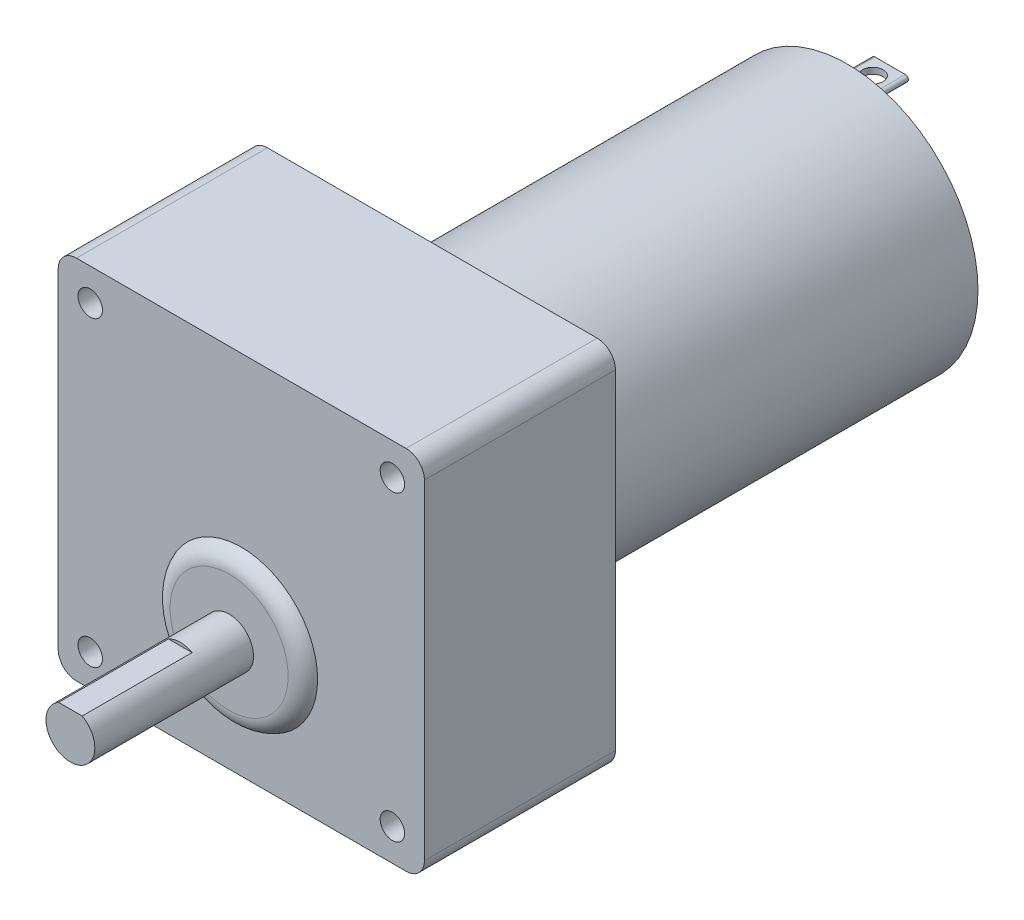
ISO-10303-21;
HEADER;
FILE_DESCRIPTION(('STEP AP214'),'2;1');
FILE_NAME('part.step','',(''),(''),'','','');
FILE_SCHEMA(('AUTOMOTIVE_DESIGN { 1 0 10303 214 1 1 1 1 }'));
ENDSEC;
DATA;
#1=APPLICATION_CONTEXT('core data for automotive mechanical design processes');
#2=APPLICATION_PROTOCOL_DEFINITION('international standard','automotive_design',2000,#1);
#3=PRODUCT_CONTEXT('',#1,'mechanical');
#4=PRODUCT('Part','Part','',(#3));
#5=PRODUCT_RELATED_PRODUCT_CATEGORY('part','',(#4));
#6=PRODUCT_DEFINITION_FORMATION('','',#4);
#7=PRODUCT_DEFINITION_CONTEXT('part definition',#1,'design');
#8=PRODUCT_DEFINITION('design','',#6,#7);
#9=PRODUCT_DEFINITION_SHAPE('','',#8);
#10=(LENGTH_UNIT() NAMED_UNIT(*) SI_UNIT(.MILLI.,.METRE.));
#11=(NAMED_UNIT(*) PLANE_ANGLE_UNIT() SI_UNIT($,.RADIAN.));
#12=(NAMED_UNIT(*) SI_UNIT($,.STERADIAN.) SOLID_ANGLE_UNIT());
#13=UNCERTAINTY_MEASURE_WITH_UNIT(LENGTH_MEASURE(1.E-05),#10,'distance_accuracy_value','');
#14=(GEOMETRIC_REPRESENTATION_CONTEXT(3) GLOBAL_UNCERTAINTY_ASSIGNED_CONTEXT((#13)) GLOBAL_UNIT_ASSIGNED_CONTEXT((#10,
#11,#12)) REPRESENTATION_CONTEXT('',''));
#15=CARTESIAN_POINT('',(0.,0.,0.));
#16=DIRECTION('',(0.,0.,1.));
#17=DIRECTION('',(1.,0.,0.));
#18=AXIS2_PLACEMENT_3D('',#15,#16,#17);
#19=CARTESIAN_POINT('',(0.,0.,0.));
#20=DIRECTION('',(0.,0.,1.));
#21=DIRECTION('',(1.,0.,0.));
#22=AXIS2_PLACEMENT_3D('',#19,#20,#21);
#23=PLANE('',#22);
#24=CARTESIAN_POINT('',(2.5,17.15,0.));
#25=DIRECTION('',(0.,0.,-1.));
#26=DIRECTION('',(-1.,0.,0.));
#27=AXIS2_PLACEMENT_3D('',#24,#25,#26);
#28=CIRCLE('',#27,0.5);
#29=CARTESIAN_POINT('',(2.5,17.65,0.));
#30=VERTEX_POINT('',#29);
#31=CARTESIAN_POINT('',(2.5,16.65,0.));
#32=VERTEX_POINT('',#31);
#33=EDGE_CURVE('E166',#30,#32,#28,.T.);
#34=ORIENTED_EDGE('',*,*,#33,.F.);
#35=DIRECTION('',(1.,0.,0.));
#36=VECTOR('',#35,1.);
#37=CARTESIAN_POINT('',(2.5,17.65,0.));
#38=LINE('',#37,#36);
#39=CARTESIAN_POINT('',(-2.5,17.65,0.));
#40=VERTEX_POINT('',#39);
#41=EDGE_CURVE('E199',#40,#30,#38,.T.);
#42=ORIENTED_EDGE('',*,*,#41,.F.);
#43=CARTESIAN_POINT('',(-2.5,17.15,0.));
#44=DIRECTION('',(0.,0.,-1.));
#45=DIRECTION('',(-1.,0.,0.));
#46=AXIS2_PLACEMENT_3D('',#43,#44,#45);
#47=CIRCLE('',#46,0.5);
#48=CARTESIAN_POINT('',(-2.5,16.65,0.));
#49=VERTEX_POINT('',#48);
#50=EDGE_CURVE('E211',#49,#40,#47,.T.);
#51=ORIENTED_EDGE('',*,*,#50,.F.);
#52=DIRECTION('',(-1.,0.,0.));
#53=VECTOR('',#52,1.);
#54=CARTESIAN_POINT('',(2.5,16.65,0.));
#55=LINE('',#54,#53);
#56=EDGE_CURVE('E208',#32,#49,#55,.T.);
#57=ORIENTED_EDGE('',*,*,#56,.F.);
#58=EDGE_LOOP('',(#34,#42,#51,#57));
#59=FACE_BOUND('',#58,.T.);
#60=CARTESIAN_POINT('',(0.,0.,0.));
#61=DIRECTION('',(0.,0.,1.));
#62=DIRECTION('',(1.,0.,0.));
#63=AXIS2_PLACEMENT_3D('',#60,#61,#62);
#64=CIRCLE('',#63,21.4);
#65=CARTESIAN_POINT('',(21.4,0.,0.));
#66=VERTEX_POINT('',#65);
#67=EDGE_CURVE('E286',#66,#66,#64,.T.);
#68=ORIENTED_EDGE('',*,*,#67,.F.);
#69=EDGE_LOOP('',(#68));
#70=FACE_BOUND('',#69,.T.);
#71=CARTESIAN_POINT('',(2.5,-17.15,0.));
#72=DIRECTION('',(0.,0.,-1.));
#73=DIRECTION('',(1.,0.,0.));
#74=AXIS2_PLACEMENT_3D('',#71,#72,#73);
#75=CIRCLE('',#74,0.5);
#76=CARTESIAN_POINT('',(2.5,-16.65,0.));
#77=VERTEX_POINT('',#76);
#78=CARTESIAN_POINT('',(2.5,-17.65,0.));
#79=VERTEX_POINT('',#78);
#80=EDGE_CURVE('E160',#77,#79,#75,.T.);
#81=ORIENTED_EDGE('',*,*,#80,.F.);
#82=DIRECTION('',(1.,0.,0.));
#83=VECTOR('',#82,1.);
#84=CARTESIAN_POINT('',(2.5,-16.65,0.));
#85=LINE('',#84,#83);
#86=CARTESIAN_POINT('',(-2.5,-16.65,0.));
#87=VERTEX_POINT('',#86);
#88=EDGE_CURVE('E162',#87,#77,#85,.T.);
#89=ORIENTED_EDGE('',*,*,#88,.F.);
#90=CARTESIAN_POINT('',(-2.5,-17.15,0.));
#91=DIRECTION('',(0.,0.,-1.));
#92=DIRECTION('',(1.,0.,0.));
#93=AXIS2_PLACEMENT_3D('',#90,#91,#92);
#94=CIRCLE('',#93,0.5);
#95=CARTESIAN_POINT('',(-2.5,-17.65,0.));
#96=VERTEX_POINT('',#95);
#97=EDGE_CURVE('E59',#96,#87,#94,.T.);
#98=ORIENTED_EDGE('',*,*,#97,.F.);
#99=DIRECTION('',(-1.,0.,0.));
#100=VECTOR('',#99,1.);
#101=CARTESIAN_POINT('',(2.5,-17.65,0.));
#102=LINE('',#101,#100);
#103=EDGE_CURVE('E54',#79,#96,#102,.T.);
#104=ORIENTED_EDGE('',*,*,#103,.F.);
#105=EDGE_LOOP('',(#81,#89,#98,#104));
#106=FACE_BOUND('',#105,.T.);
#107=ADVANCED_FACE('F38',(#59,#70,#106),#23,.F.);
#108=CARTESIAN_POINT('',(0.,-10.,109.3));
#109=DIRECTION('',(0.,0.,1.));
#110=DIRECTION('',(1.,0.,0.));
#111=AXIS2_PLACEMENT_3D('',#108,#109,#110);
#112=PLANE('',#111);
#113=CARTESIAN_POINT('',(0.,-10.,109.3));
#114=DIRECTION('',(0.,0.,1.));
#115=DIRECTION('',(1.,0.,0.));
#116=AXIS2_PLACEMENT_3D('',#113,#114,#115);
#117=CIRCLE('',#116,4.);
#118=CARTESIAN_POINT('',(1.93649167310371,-6.5,109.3));
#119=VERTEX_POINT('',#118);
#120=CARTESIAN_POINT('',(-1.93649167310371,-6.5,109.3));
#121=VERTEX_POINT('',#120);
#122=EDGE_CURVE('E240',#119,#121,#117,.T.);
#123=ORIENTED_EDGE('',*,*,#122,.T.);
#124=DIRECTION('',(1.,0.,0.));
#125=VECTOR('',#124,1.);
#126=CARTESIAN_POINT('',(0.,-6.5,109.3));
#127=LINE('',#126,#125);
#128=EDGE_CURVE('E227',#121,#119,#127,.T.);
#129=ORIENTED_EDGE('',*,*,#128,.T.);
#130=EDGE_LOOP('',(#123,#129));
#131=FACE_BOUND('',#130,.T.);
#132=ADVANCED_FACE('F385',(#131),#112,.T.);
#133=CARTESIAN_POINT('',(0.,0.,68.));
#134=DIRECTION('',(0.,0.,-1.));
#135=DIRECTION('',(-1.,0.,0.));
#136=AXIS2_PLACEMENT_3D('',#133,#134,#135);
#137=CYLINDRICAL_SURFACE('',#136,21.4);
#138=CARTESIAN_POINT('',(0.,0.,68.));
#139=DIRECTION('',(0.,0.,1.));
#140=DIRECTION('',(1.,0.,0.));
#141=AXIS2_PLACEMENT_3D('',#138,#139,#140);
#142=CIRCLE('',#141,21.4);
#143=CARTESIAN_POINT('',(21.4,0.,68.));
#144=VERTEX_POINT('',#143);
#145=EDGE_CURVE('E297',#144,#144,#142,.T.);
#146=ORIENTED_EDGE('',*,*,#145,.F.);
#147=EDGE_LOOP('',(#146));
#148=FACE_BOUND('',#147,.T.);
#149=ORIENTED_EDGE('',*,*,#67,.T.);
#150=EDGE_LOOP('',(#149));
#151=FACE_BOUND('',#150,.T.);
#152=ADVANCED_FACE('F391',(#148,#151),#137,.T.);
#153=CARTESIAN_POINT('',(0.,0.,99.3));
#154=DIRECTION('',(0.,0.,1.));
#155=DIRECTION('',(1.,0.,0.));
#156=AXIS2_PLACEMENT_3D('',#153,#154,#155);
#157=PLANE('',#156);
#158=CARTESIAN_POINT('',(0.,-10.,99.3));
#159=DIRECTION('',(0.,0.,1.));
#160=DIRECTION('',(1.,0.,0.));
#161=AXIS2_PLACEMENT_3D('',#158,#159,#160);
#162=CIRCLE('',#161,12.5);
#163=CARTESIAN_POINT('',(12.5,-10.,99.3));
#164=VERTEX_POINT('',#163);
#165=EDGE_CURVE('E243',#164,#164,#162,.T.);
#166=ORIENTED_EDGE('',*,*,#165,.F.);
#167=EDGE_LOOP('',(#166));
#168=FACE_BOUND('',#167,.T.);
#169=CARTESIAN_POINT('',(24.75,-24.75,99.3));
#170=DIRECTION('',(0.,0.,1.));
#171=DIRECTION('',(-1.,0.,0.));
#172=AXIS2_PLACEMENT_3D('',#169,#170,#171);
#173=CIRCLE('',#172,2.);
#174=CARTESIAN_POINT('',(22.75,-24.75,99.3));
#175=VERTEX_POINT('',#174);
#176=EDGE_CURVE('E255',#175,#175,#173,.T.);
#177=ORIENTED_EDGE('',*,*,#176,.F.);
#178=EDGE_LOOP('',(#177));
#179=FACE_BOUND('',#178,.T.);
#180=CARTESIAN_POINT('',(-24.75,24.75,99.3));
#181=DIRECTION('',(0.,0.,1.));
#182=DIRECTION('',(1.,0.,0.));
#183=AXIS2_PLACEMENT_3D('',#180,#181,#182);
#184=CIRCLE('',#183,2.);
#185=CARTESIAN_POINT('',(-22.75,24.75,99.3));
#186=VERTEX_POINT('',#185);
#187=EDGE_CURVE('E267',#186,#186,#184,.T.);
#188=ORIENTED_EDGE('',*,*,#187,.F.);
#189=EDGE_LOOP('',(#188));
#190=FACE_BOUND('',#189,.T.);
#191=DIRECTION('',(-1.,0.,0.));
#192=VECTOR('',#191,1.);
#193=CARTESIAN_POINT('',(-30.,30.,99.3));
#194=LINE('',#193,#192);
#195=CARTESIAN_POINT('',(27.,30.,99.3));
#196=VERTEX_POINT('',#195);
#197=CARTESIAN_POINT('',(-27.,30.,99.3));
#198=VERTEX_POINT('',#197);
#199=EDGE_CURVE('E276',#196,#198,#194,.T.);
#200=ORIENTED_EDGE('',*,*,#199,.T.);
#201=CARTESIAN_POINT('',(-27.,27.,99.3));
#202=DIRECTION('',(0.,0.,1.));
#203=DIRECTION('',(1.,0.,0.));
#204=AXIS2_PLACEMENT_3D('',#201,#202,#203);
#205=CIRCLE('',#204,3.);
#206=CARTESIAN_POINT('',(-30.,27.,99.3));
#207=VERTEX_POINT('',#206);
#208=EDGE_CURVE('E329',#198,#207,#205,.T.);
#209=ORIENTED_EDGE('',*,*,#208,.T.);
#210=DIRECTION('',(0.,-1.,0.));
#211=VECTOR('',#210,1.);
#212=CARTESIAN_POINT('',(-30.,30.,99.3));
#213=LINE('',#212,#211);
#214=CARTESIAN_POINT('',(-30.,-27.,99.3));
#215=VERTEX_POINT('',#214);
#216=EDGE_CURVE('E280',#207,#215,#213,.T.);
#217=ORIENTED_EDGE('',*,*,#216,.T.);
#218=CARTESIAN_POINT('',(-27.,-27.,99.3));
#219=DIRECTION('',(0.,0.,1.));
#220=DIRECTION('',(1.,0.,0.));
#221=AXIS2_PLACEMENT_3D('',#218,#219,#220);
#222=CIRCLE('',#221,3.);
#223=CARTESIAN_POINT('',(-27.,-30.,99.3));
#224=VERTEX_POINT('',#223);
#225=EDGE_CURVE('E327',#215,#224,#222,.T.);
#226=ORIENTED_EDGE('',*,*,#225,.T.);
#227=DIRECTION('',(1.,0.,0.));
#228=VECTOR('',#227,1.);
#229=CARTESIAN_POINT('',(-30.,-30.,99.3));
#230=LINE('',#229,#228);
#231=CARTESIAN_POINT('',(27.,-30.,99.3));
#232=VERTEX_POINT('',#231);
#233=EDGE_CURVE('E283',#224,#232,#230,.T.);
#234=ORIENTED_EDGE('',*,*,#233,.T.);
#235=CARTESIAN_POINT('',(27.,-27.,99.3));
#236=DIRECTION('',(0.,0.,1.));
#237=DIRECTION('',(1.,0.,0.));
#238=AXIS2_PLACEMENT_3D('',#235,#236,#237);
#239=CIRCLE('',#238,3.);
#240=CARTESIAN_POINT('',(30.,-27.,99.3));
#241=VERTEX_POINT('',#240);
#242=EDGE_CURVE('E325',#232,#241,#239,.T.);
#243=ORIENTED_EDGE('',*,*,#242,.T.);
#244=DIRECTION('',(0.,1.,0.));
#245=VECTOR('',#244,1.);
#246=CARTESIAN_POINT('',(30.,30.,99.3));
#247=LINE('',#246,#245);
#248=CARTESIAN_POINT('',(30.,27.,99.3));
#249=VERTEX_POINT('',#248);
#250=EDGE_CURVE('E273',#241,#249,#247,.T.);
#251=ORIENTED_EDGE('',*,*,#250,.T.);
#252=CARTESIAN_POINT('',(27.,27.,99.3));
#253=DIRECTION('',(0.,0.,1.));
#254=DIRECTION('',(1.,0.,0.));
#255=AXIS2_PLACEMENT_3D('',#252,#253,#254);
#256=CIRCLE('',#255,3.);
#257=EDGE_CURVE('E323',#249,#196,#256,.T.);
#258=ORIENTED_EDGE('',*,*,#257,.T.);
#259=EDGE_LOOP('',(#200,#209,#217,#226,#234,#243,#251,#258));
#260=FACE_BOUND('',#259,.T.);
#261=CARTESIAN_POINT('',(24.75,24.75,99.3));
#262=DIRECTION('',(0.,0.,1.));
#263=DIRECTION('',(1.,0.,0.));
#264=AXIS2_PLACEMENT_3D('',#261,#262,#263);
#265=CIRCLE('',#264,2.);
#266=CARTESIAN_POINT('',(26.75,24.75,99.3));
#267=VERTEX_POINT('',#266);
#268=EDGE_CURVE('E261',#267,#267,#265,.T.);
#269=ORIENTED_EDGE('',*,*,#268,.F.);
#270=EDGE_LOOP('',(#269));
#271=FACE_BOUND('',#270,.T.);
#272=CARTESIAN_POINT('',(-24.75,-24.75,99.3));
#273=DIRECTION('',(0.,0.,1.));
#274=DIRECTION('',(-1.,0.,0.));
#275=AXIS2_PLACEMENT_3D('',#272,#273,#274);
#276=CIRCLE('',#275,2.);
#277=CARTESIAN_POINT('',(-26.75,-24.75,99.3));
#278=VERTEX_POINT('',#277);
#279=EDGE_CURVE('E249',#278,#278,#276,.T.);
#280=ORIENTED_EDGE('',*,*,#279,.F.);
#281=EDGE_LOOP('',(#280));
#282=FACE_BOUND('',#281,.T.);
#283=ADVANCED_FACE('F345',(#168,#179,#190,#260,#271,#282),#157,.T.);
#284=CARTESIAN_POINT('',(0.,0.,68.));
#285=DIRECTION('',(0.,0.,1.));
#286=DIRECTION('',(1.,0.,0.));
#287=AXIS2_PLACEMENT_3D('',#284,#285,#286);
#288=PLANE('',#287);
#289=ORIENTED_EDGE('',*,*,#145,.T.);
#290=EDGE_LOOP('',(#289));
#291=FACE_BOUND('',#290,.T.);
#292=DIRECTION('',(0.,-1.,0.));
#293=VECTOR('',#292,1.);
#294=CARTESIAN_POINT('',(-30.,30.,68.));
#295=LINE('',#294,#293);
#296=CARTESIAN_POINT('',(-30.,27.,68.));
#297=VERTEX_POINT('',#296);
#298=CARTESIAN_POINT('',(-30.,-27.,68.));
#299=VERTEX_POINT('',#298);
#300=EDGE_CURVE('E292',#297,#299,#295,.T.);
#301=ORIENTED_EDGE('',*,*,#300,.F.);
#302=CARTESIAN_POINT('',(-27.,27.,68.));
#303=DIRECTION('',(0.,0.,1.));
#304=DIRECTION('',(1.,0.,0.));
#305=AXIS2_PLACEMENT_3D('',#302,#303,#304);
#306=CIRCLE('',#305,3.);
#307=CARTESIAN_POINT('',(-27.,30.,68.));
#308=VERTEX_POINT('',#307);
#309=EDGE_CURVE('E316',#297,#308,#306,.F.);
#310=ORIENTED_EDGE('',*,*,#309,.T.);
#311=DIRECTION('',(-1.,0.,0.));
#312=VECTOR('',#311,1.);
#313=CARTESIAN_POINT('',(-30.,30.,68.));
#314=LINE('',#313,#312);
#315=CARTESIAN_POINT('',(27.,30.,68.));
#316=VERTEX_POINT('',#315);
#317=EDGE_CURVE('E289',#316,#308,#314,.T.);
#318=ORIENTED_EDGE('',*,*,#317,.F.);
#319=CARTESIAN_POINT('',(27.,27.,68.));
#320=DIRECTION('',(0.,0.,1.));
#321=DIRECTION('',(1.,0.,0.));
#322=AXIS2_PLACEMENT_3D('',#319,#320,#321);
#323=CIRCLE('',#322,3.);
#324=CARTESIAN_POINT('',(30.,27.,68.));
#325=VERTEX_POINT('',#324);
#326=EDGE_CURVE('E310',#316,#325,#323,.F.);
#327=ORIENTED_EDGE('',*,*,#326,.T.);
#328=DIRECTION('',(0.,1.,0.));
#329=VECTOR('',#328,1.);
#330=CARTESIAN_POINT('',(30.,30.,68.));
#331=LINE('',#330,#329);
#332=CARTESIAN_POINT('',(30.,-27.,68.));
#333=VERTEX_POINT('',#332);
#334=EDGE_CURVE('E270',#333,#325,#331,.T.);
#335=ORIENTED_EDGE('',*,*,#334,.F.);
#336=CARTESIAN_POINT('',(27.,-27.,68.));
#337=DIRECTION('',(0.,0.,1.));
#338=DIRECTION('',(1.,0.,0.));
#339=AXIS2_PLACEMENT_3D('',#336,#337,#338);
#340=CIRCLE('',#339,3.);
#341=CARTESIAN_POINT('',(27.,-30.,68.));
#342=VERTEX_POINT('',#341);
#343=EDGE_CURVE('E312',#333,#342,#340,.F.);
#344=ORIENTED_EDGE('',*,*,#343,.T.);
#345=DIRECTION('',(1.,0.,0.));
#346=VECTOR('',#345,1.);
#347=CARTESIAN_POINT('',(-30.,-30.,68.));
#348=LINE('',#347,#346);
#349=CARTESIAN_POINT('',(-27.,-30.,68.));
#350=VERTEX_POINT('',#349);
#351=EDGE_CURVE('E277',#350,#342,#348,.T.);
#352=ORIENTED_EDGE('',*,*,#351,.F.);
#353=CARTESIAN_POINT('',(-27.,-27.,68.));
#354=DIRECTION('',(0.,0.,1.));
#355=DIRECTION('',(1.,0.,0.));
#356=AXIS2_PLACEMENT_3D('',#353,#354,#355);
#357=CIRCLE('',#356,3.);
#358=EDGE_CURVE('E314',#350,#299,#357,.F.);
#359=ORIENTED_EDGE('',*,*,#358,.T.);
#360=EDGE_LOOP('',(#301,#310,#318,#327,#335,#344,#352,#359));
#361=FACE_BOUND('',#360,.T.);
#362=CARTESIAN_POINT('',(-24.75,24.75,68.));
#363=DIRECTION('',(0.,0.,1.));
#364=DIRECTION('',(1.,0.,0.));
#365=AXIS2_PLACEMENT_3D('',#362,#363,#364);
#366=CIRCLE('',#365,2.);
#367=CARTESIAN_POINT('',(-22.75,24.75,68.));
#368=VERTEX_POINT('',#367);
#369=EDGE_CURVE('E264',#368,#368,#366,.T.);
#370=ORIENTED_EDGE('',*,*,#369,.T.);
#371=EDGE_LOOP('',(#370));
#372=FACE_BOUND('',#371,.T.);
#373=CARTESIAN_POINT('',(24.75,24.75,68.));
#374=DIRECTION('',(0.,0.,1.));
#375=DIRECTION('',(1.,0.,0.));
#376=AXIS2_PLACEMENT_3D('',#373,#374,#375);
#377=CIRCLE('',#376,2.);
#378=CARTESIAN_POINT('',(26.75,24.75,68.));
#379=VERTEX_POINT('',#378);
#380=EDGE_CURVE('E258',#379,#379,#377,.T.);
#381=ORIENTED_EDGE('',*,*,#380,.T.);
#382=EDGE_LOOP('',(#381));
#383=FACE_BOUND('',#382,.T.);
#384=CARTESIAN_POINT('',(24.75,-24.75,68.));
#385=DIRECTION('',(0.,0.,1.));
#386=DIRECTION('',(-1.,0.,0.));
#387=AXIS2_PLACEMENT_3D('',#384,#385,#386);
#388=CIRCLE('',#387,2.);
#389=CARTESIAN_POINT('',(22.75,-24.75,68.));
#390=VERTEX_POINT('',#389);
#391=EDGE_CURVE('E252',#390,#390,#388,.T.);
#392=ORIENTED_EDGE('',*,*,#391,.T.);
#393=EDGE_LOOP('',(#392));
#394=FACE_BOUND('',#393,.T.);
#395=CARTESIAN_POINT('',(-24.75,-24.75,68.));
#396=DIRECTION('',(0.,0.,1.));
#397=DIRECTION('',(-1.,0.,0.));
#398=AXIS2_PLACEMENT_3D('',#395,#396,#397);
#399=CIRCLE('',#398,2.);
#400=CARTESIAN_POINT('',(-26.75,-24.75,68.));
#401=VERTEX_POINT('',#400);
#402=EDGE_CURVE('E248',#401,#401,#399,.T.);
#403=ORIENTED_EDGE('',*,*,#402,.T.);
#404=EDGE_LOOP('',(#403));
#405=FACE_BOUND('',#404,.T.);
#406=ADVANCED_FACE('F356',(#291,#361,#372,#383,#394,#405),#288,.F.);
#407=CARTESIAN_POINT('',(30.,30.,99.3));
#408=DIRECTION('',(-1.,0.,0.));
#409=DIRECTION('',(0.,-1.,0.));
#410=AXIS2_PLACEMENT_3D('',#407,#408,#409);
#411=PLANE('',#410);
#412=ORIENTED_EDGE('',*,*,#250,.F.);
#413=DIRECTION('',(0.,0.,-1.));
#414=VECTOR('',#413,1.);
#415=CARTESIAN_POINT('',(30.,-27.,99.3));
#416=LINE('',#415,#414);
#417=EDGE_CURVE('E11',#241,#333,#416,.T.);
#418=ORIENTED_EDGE('',*,*,#417,.T.);
#419=ORIENTED_EDGE('',*,*,#334,.T.);
#420=DIRECTION('',(0.,0.,-1.));
#421=VECTOR('',#420,1.);
#422=CARTESIAN_POINT('',(30.,27.,99.3));
#423=LINE('',#422,#421);
#424=EDGE_CURVE('E47',#325,#249,#423,.F.);
#425=ORIENTED_EDGE('',*,*,#424,.T.);
#426=EDGE_LOOP('',(#412,#418,#419,#425));
#427=FACE_BOUND('',#426,.T.);
#428=ADVANCED_FACE('F339',(#427),#411,.F.);
#429=CARTESIAN_POINT('',(-30.,30.,99.3));
#430=DIRECTION('',(0.,-1.,0.));
#431=DIRECTION('',(0.,0.,-1.));
#432=AXIS2_PLACEMENT_3D('',#429,#430,#431);
#433=PLANE('',#432);
#434=ORIENTED_EDGE('',*,*,#317,.T.);
#435=DIRECTION('',(0.,0.,-1.));
#436=VECTOR('',#435,1.);
#437=CARTESIAN_POINT('',(-27.,30.,99.3));
#438=LINE('',#437,#436);
#439=EDGE_CURVE('E321',#308,#198,#438,.F.);
#440=ORIENTED_EDGE('',*,*,#439,.T.);
#441=ORIENTED_EDGE('',*,*,#199,.F.);
#442=DIRECTION('',(0.,0.,-1.));
#443=VECTOR('',#442,1.);
#444=CARTESIAN_POINT('',(27.,30.,99.3));
#445=LINE('',#444,#443);
#446=EDGE_CURVE('E318',#196,#316,#445,.T.);
#447=ORIENTED_EDGE('',*,*,#446,.T.);
#448=EDGE_LOOP('',(#434,#440,#441,#447));
#449=FACE_BOUND('',#448,.T.);
#450=ADVANCED_FACE('F352',(#449),#433,.F.);
#451=CARTESIAN_POINT('',(-30.,30.,99.3));
#452=DIRECTION('',(1.,0.,0.));
#453=DIRECTION('',(0.,1.,0.));
#454=AXIS2_PLACEMENT_3D('',#451,#452,#453);
#455=PLANE('',#454);
#456=ORIENTED_EDGE('',*,*,#216,.F.);
#457=DIRECTION('',(0.,0.,-1.));
#458=VECTOR('',#457,1.);
#459=CARTESIAN_POINT('',(-30.,27.,99.3));
#460=LINE('',#459,#458);
#461=EDGE_CURVE('E307',#207,#297,#460,.T.);
#462=ORIENTED_EDGE('',*,*,#461,.T.);
#463=ORIENTED_EDGE('',*,*,#300,.T.);
#464=DIRECTION('',(0.,0.,-1.));
#465=VECTOR('',#464,1.);
#466=CARTESIAN_POINT('',(-30.,-27.,99.3));
#467=LINE('',#466,#465);
#468=EDGE_CURVE('E305',#299,#215,#467,.F.);
#469=ORIENTED_EDGE('',*,*,#468,.T.);
#470=EDGE_LOOP('',(#456,#462,#463,#469));
#471=FACE_BOUND('',#470,.T.);
#472=ADVANCED_FACE('F364',(#471),#455,.F.);
#473=CARTESIAN_POINT('',(-30.,-30.,99.3));
#474=DIRECTION('',(0.,1.,0.));
#475=DIRECTION('',(0.,0.,1.));
#476=AXIS2_PLACEMENT_3D('',#473,#474,#475);
#477=PLANE('',#476);
#478=ORIENTED_EDGE('',*,*,#233,.F.);
#479=DIRECTION('',(0.,0.,-1.));
#480=VECTOR('',#479,1.);
#481=CARTESIAN_POINT('',(-27.,-30.,99.3));
#482=LINE('',#481,#480);
#483=EDGE_CURVE('E333',#224,#350,#482,.T.);
#484=ORIENTED_EDGE('',*,*,#483,.T.);
#485=ORIENTED_EDGE('',*,*,#351,.T.);
#486=DIRECTION('',(0.,0.,-1.));
#487=VECTOR('',#486,1.);
#488=CARTESIAN_POINT('',(27.,-30.,99.3));
#489=LINE('',#488,#487);
#490=EDGE_CURVE('E331',#342,#232,#489,.F.);
#491=ORIENTED_EDGE('',*,*,#490,.T.);
#492=EDGE_LOOP('',(#478,#484,#485,#491));
#493=FACE_BOUND('',#492,.T.);
#494=ADVANCED_FACE('F373',(#493),#477,.F.);
#495=CARTESIAN_POINT('',(-24.75,24.75,99.3));
#496=DIRECTION('',(0.,0.,-1.));
#497=DIRECTION('',(-1.,0.,0.));
#498=AXIS2_PLACEMENT_3D('',#495,#496,#497);
#499=CYLINDRICAL_SURFACE('',#498,2.);
#500=ORIENTED_EDGE('',*,*,#187,.T.);
#501=EDGE_LOOP('',(#500));
#502=FACE_BOUND('',#501,.T.);
#503=ORIENTED_EDGE('',*,*,#369,.F.);
#504=EDGE_LOOP('',(#503));
#505=FACE_BOUND('',#504,.T.);
#506=ADVANCED_FACE('F441',(#502,#505),#499,.F.);
#507=CARTESIAN_POINT('',(24.75,24.75,99.3));
#508=DIRECTION('',(0.,0.,-1.));
#509=DIRECTION('',(-1.,0.,0.));
#510=AXIS2_PLACEMENT_3D('',#507,#508,#509);
#511=CYLINDRICAL_SURFACE('',#510,2.);
#512=ORIENTED_EDGE('',*,*,#268,.T.);
#513=EDGE_LOOP('',(#512));
#514=FACE_BOUND('',#513,.T.);
#515=ORIENTED_EDGE('',*,*,#380,.F.);
#516=EDGE_LOOP('',(#515));
#517=FACE_BOUND('',#516,.T.);
#518=ADVANCED_FACE('F437',(#514,#517),#511,.F.);
#519=CARTESIAN_POINT('',(24.75,-24.75,99.3));
#520=DIRECTION('',(0.,0.,-1.));
#521=DIRECTION('',(-1.,0.,0.));
#522=AXIS2_PLACEMENT_3D('',#519,#520,#521);
#523=CYLINDRICAL_SURFACE('',#522,2.);
#524=ORIENTED_EDGE('',*,*,#176,.T.);
#525=EDGE_LOOP('',(#524));
#526=FACE_BOUND('',#525,.T.);
#527=ORIENTED_EDGE('',*,*,#391,.F.);
#528=EDGE_LOOP('',(#527));
#529=FACE_BOUND('',#528,.T.);
#530=ADVANCED_FACE('F433',(#526,#529),#523,.F.);
#531=CARTESIAN_POINT('',(-24.75,-24.75,99.3));
#532=DIRECTION('',(0.,0.,-1.));
#533=DIRECTION('',(-1.,0.,0.));
#534=AXIS2_PLACEMENT_3D('',#531,#532,#533);
#535=CYLINDRICAL_SURFACE('',#534,2.);
#536=ORIENTED_EDGE('',*,*,#279,.T.);
#537=EDGE_LOOP('',(#536));
#538=FACE_BOUND('',#537,.T.);
#539=ORIENTED_EDGE('',*,*,#402,.F.);
#540=EDGE_LOOP('',(#539));
#541=FACE_BOUND('',#540,.T.);
#542=ADVANCED_FACE('F429',(#538,#541),#535,.F.);
#543=CARTESIAN_POINT('',(0.,-10.,101.3));
#544=DIRECTION('',(0.,0.,1.));
#545=DIRECTION('',(1.,0.,0.));
#546=AXIS2_PLACEMENT_3D('',#543,#544,#545);
#547=PLANE('',#546);
#548=CARTESIAN_POINT('',(0.,-10.,101.3));
#549=DIRECTION('',(0.,0.,1.));
#550=DIRECTION('',(1.,0.,0.));
#551=AXIS2_PLACEMENT_3D('',#548,#549,#550);
#552=CIRCLE('',#551,4.);
#553=CARTESIAN_POINT('',(4.,-10.,101.3));
#554=VERTEX_POINT('',#553);
#555=EDGE_CURVE('E239',#554,#554,#552,.T.);
#556=ORIENTED_EDGE('',*,*,#555,.F.);
#557=EDGE_LOOP('',(#556));
#558=FACE_BOUND('',#557,.T.);
#559=CARTESIAN_POINT('',(0.,-10.,101.3));
#560=DIRECTION('',(0.,0.,1.));
#561=DIRECTION('',(1.,0.,0.));
#562=AXIS2_PLACEMENT_3D('',#559,#560,#561);
#563=CIRCLE('',#562,9.67157287525381);
#564=CARTESIAN_POINT('',(9.67157287525381,-10.,101.3));
#565=VERTEX_POINT('',#564);
#566=EDGE_CURVE('E300',#565,#565,#563,.T.);
#567=ORIENTED_EDGE('',*,*,#566,.T.);
#568=EDGE_LOOP('',(#567));
#569=FACE_BOUND('',#568,.T.);
#570=ADVANCED_FACE('F405',(#558,#569),#547,.T.);
#571=CARTESIAN_POINT('',(0.,-10.,98.3));
#572=DIRECTION('',(0.,0.,-1.));
#573=DIRECTION('',(-1.,0.,0.));
#574=AXIS2_PLACEMENT_3D('',#571,#572,#573);
#575=TOROIDAL_SURFACE('',#574,9.67157287525381,3.);
#576=ORIENTED_EDGE('',*,*,#165,.T.);
#577=EDGE_LOOP('',(#576));
#578=FACE_BOUND('',#577,.T.);
#579=ORIENTED_EDGE('',*,*,#566,.F.);
#580=EDGE_LOOP('',(#579));
#581=FACE_BOUND('',#580,.T.);
#582=ADVANCED_FACE('F401',(#578,#581),#575,.T.);
#583=CARTESIAN_POINT('',(0.,-10.,109.3));
#584=DIRECTION('',(0.,0.,-1.));
#585=DIRECTION('',(-1.,0.,0.));
#586=AXIS2_PLACEMENT_3D('',#583,#584,#585);
#587=CYLINDRICAL_SURFACE('',#586,4.);
#588=ORIENTED_EDGE('',*,*,#122,.F.);
#589=DIRECTION('',(0.,0.,-1.));
#590=VECTOR('',#589,1.);
#591=CARTESIAN_POINT('',(1.93649167310371,-6.5,127.3));
#592=LINE('',#591,#590);
#593=CARTESIAN_POINT('',(1.93649167310371,-6.5,127.3));
#594=VERTEX_POINT('',#593);
#595=EDGE_CURVE('E233',#594,#119,#592,.T.);
#596=ORIENTED_EDGE('',*,*,#595,.F.);
#597=CARTESIAN_POINT('',(0.,-10.,127.3));
#598=DIRECTION('',(0.,0.,1.));
#599=DIRECTION('',(1.,0.,0.));
#600=AXIS2_PLACEMENT_3D('',#597,#598,#599);
#601=CIRCLE('',#600,4.);
#602=CARTESIAN_POINT('',(-1.93649167310371,-6.5,127.3));
#603=VERTEX_POINT('',#602);
#604=EDGE_CURVE('E231',#603,#594,#601,.T.);
#605=ORIENTED_EDGE('',*,*,#604,.F.);
#606=DIRECTION('',(0.,0.,-1.));
#607=VECTOR('',#606,1.);
#608=CARTESIAN_POINT('',(-1.93649167310371,-6.5,127.3));
#609=LINE('',#608,#607);
#610=EDGE_CURVE('E237',#603,#121,#609,.T.);
#611=ORIENTED_EDGE('',*,*,#610,.T.);
#612=EDGE_LOOP('',(#588,#596,#605,#611));
#613=FACE_BOUND('',#612,.T.);
#614=ORIENTED_EDGE('',*,*,#555,.T.);
#615=EDGE_LOOP('',(#614));
#616=FACE_BOUND('',#615,.T.);
#617=ADVANCED_FACE('F404',(#613,#616),#587,.T.);
#618=CARTESIAN_POINT('',(0.,-6.5,127.3));
#619=DIRECTION('',(0.,1.,0.));
#620=DIRECTION('',(0.,0.,1.));
#621=AXIS2_PLACEMENT_3D('',#618,#619,#620);
#622=PLANE('',#621);
#623=ORIENTED_EDGE('',*,*,#128,.F.);
#624=ORIENTED_EDGE('',*,*,#610,.F.);
#625=DIRECTION('',(1.,0.,0.));
#626=VECTOR('',#625,1.);
#627=CARTESIAN_POINT('',(0.,-6.5,127.3));
#628=LINE('',#627,#626);
#629=EDGE_CURVE('E228',#603,#594,#628,.T.);
#630=ORIENTED_EDGE('',*,*,#629,.T.);
#631=ORIENTED_EDGE('',*,*,#595,.T.);
#632=EDGE_LOOP('',(#623,#624,#630,#631));
#633=FACE_BOUND('',#632,.T.);
#634=ADVANCED_FACE('F412',(#633),#622,.T.);
#635=CARTESIAN_POINT('',(0.,0.,127.3));
#636=DIRECTION('',(0.,0.,1.));
#637=DIRECTION('',(1.,0.,0.));
#638=AXIS2_PLACEMENT_3D('',#635,#636,#637);
#639=PLANE('',#638);
#640=ORIENTED_EDGE('',*,*,#629,.F.);
#641=ORIENTED_EDGE('',*,*,#604,.T.);
#642=EDGE_LOOP('',(#640,#641));
#643=FACE_BOUND('',#642,.T.);
#644=ADVANCED_FACE('F408',(#643),#639,.T.);
#645=CARTESIAN_POINT('',(-27.,27.,99.3));
#646=DIRECTION('',(0.,0.,-1.));
#647=DIRECTION('',(-1.,0.,0.));
#648=AXIS2_PLACEMENT_3D('',#645,#646,#647);
#649=CYLINDRICAL_SURFACE('',#648,3.);
#650=ORIENTED_EDGE('',*,*,#208,.F.);
#651=ORIENTED_EDGE('',*,*,#439,.F.);
#652=ORIENTED_EDGE('',*,*,#309,.F.);
#653=ORIENTED_EDGE('',*,*,#461,.F.);
#654=EDGE_LOOP('',(#650,#651,#652,#653));
#655=FACE_BOUND('',#654,.T.);
#656=ADVANCED_FACE('F361',(#655),#649,.T.);
#657=CARTESIAN_POINT('',(-27.,-27.,99.3));
#658=DIRECTION('',(0.,0.,-1.));
#659=DIRECTION('',(-1.,0.,0.));
#660=AXIS2_PLACEMENT_3D('',#657,#658,#659);
#661=CYLINDRICAL_SURFACE('',#660,3.);
#662=ORIENTED_EDGE('',*,*,#225,.F.);
#663=ORIENTED_EDGE('',*,*,#468,.F.);
#664=ORIENTED_EDGE('',*,*,#358,.F.);
#665=ORIENTED_EDGE('',*,*,#483,.F.);
#666=EDGE_LOOP('',(#662,#663,#664,#665));
#667=FACE_BOUND('',#666,.T.);
#668=ADVANCED_FACE('F370',(#667),#661,.T.);
#669=CARTESIAN_POINT('',(27.,-27.,99.3));
#670=DIRECTION('',(0.,0.,-1.));
#671=DIRECTION('',(-1.,0.,0.));
#672=AXIS2_PLACEMENT_3D('',#669,#670,#671);
#673=CYLINDRICAL_SURFACE('',#672,3.);
#674=ORIENTED_EDGE('',*,*,#242,.F.);
#675=ORIENTED_EDGE('',*,*,#490,.F.);
#676=ORIENTED_EDGE('',*,*,#343,.F.);
#677=ORIENTED_EDGE('',*,*,#417,.F.);
#678=EDGE_LOOP('',(#674,#675,#676,#677));
#679=FACE_BOUND('',#678,.T.);
#680=ADVANCED_FACE('F376',(#679),#673,.T.);
#681=CARTESIAN_POINT('',(27.,27.,99.3));
#682=DIRECTION('',(0.,0.,-1.));
#683=DIRECTION('',(-1.,0.,0.));
#684=AXIS2_PLACEMENT_3D('',#681,#682,#683);
#685=CYLINDRICAL_SURFACE('',#684,3.);
#686=ORIENTED_EDGE('',*,*,#257,.F.);
#687=ORIENTED_EDGE('',*,*,#424,.F.);
#688=ORIENTED_EDGE('',*,*,#326,.F.);
#689=ORIENTED_EDGE('',*,*,#446,.F.);
#690=EDGE_LOOP('',(#686,#687,#688,#689));
#691=FACE_BOUND('',#690,.T.);
#692=ADVANCED_FACE('F40',(#691),#685,.T.);
#693=CARTESIAN_POINT('',(2.5,17.15,-7.));
#694=DIRECTION('',(0.,0.,1.));
#695=DIRECTION('',(1.,0.,0.));
#696=AXIS2_PLACEMENT_3D('',#693,#694,#695);
#697=CYLINDRICAL_SURFACE('',#696,0.5);
#698=ORIENTED_EDGE('',*,*,#33,.T.);
#699=DIRECTION('',(0.,0.,1.));
#700=VECTOR('',#699,1.);
#701=CARTESIAN_POINT('',(2.5,16.65,-7.));
#702=LINE('',#701,#700);
#703=CARTESIAN_POINT('',(2.5,16.65,-7.));
#704=VERTEX_POINT('',#703);
#705=EDGE_CURVE('E224',#704,#32,#702,.T.);
#706=ORIENTED_EDGE('',*,*,#705,.F.);
#707=CARTESIAN_POINT('',(2.5,17.15,-7.));
#708=DIRECTION('',(0.,0.,-1.));
#709=DIRECTION('',(-1.,0.,0.));
#710=AXIS2_PLACEMENT_3D('',#707,#708,#709);
#711=CIRCLE('',#710,0.5);
#712=CARTESIAN_POINT('',(2.5,17.65,-7.));
#713=VERTEX_POINT('',#712);
#714=EDGE_CURVE('E195',#713,#704,#711,.T.);
#715=ORIENTED_EDGE('',*,*,#714,.F.);
#716=DIRECTION('',(0.,0.,1.));
#717=VECTOR('',#716,1.);
#718=CARTESIAN_POINT('',(2.5,17.65,-7.));
#719=LINE('',#718,#717);
#720=EDGE_CURVE('E205',#713,#30,#719,.T.);
#721=ORIENTED_EDGE('',*,*,#720,.T.);
#722=EDGE_LOOP('',(#698,#706,#715,#721));
#723=FACE_BOUND('',#722,.T.);
#724=ADVANCED_FACE('F382',(#723),#697,.T.);
#725=CARTESIAN_POINT('',(2.5,16.65,-7.));
#726=DIRECTION('',(0.,1.,0.));
#727=DIRECTION('',(0.,0.,1.));
#728=AXIS2_PLACEMENT_3D('',#725,#726,#727);
#729=PLANE('',#728);
#730=CARTESIAN_POINT('',(0.,16.65,-4.17632220252176));
#731=DIRECTION('',(0.,1.,0.));
#732=DIRECTION('',(0.,0.,1.));
#733=AXIS2_PLACEMENT_3D('',#730,#731,#732);
#734=CIRCLE('',#733,1.6863175990901);
#735=CARTESIAN_POINT('',(0.,16.65,-2.49000460343166));
#736=VERTEX_POINT('',#735);
#737=EDGE_CURVE('E684',#736,#736,#734,.T.);
#738=ORIENTED_EDGE('',*,*,#737,.T.);
#739=EDGE_LOOP('',(#738));
#740=FACE_BOUND('',#739,.T.);
#741=ORIENTED_EDGE('',*,*,#56,.T.);
#742=DIRECTION('',(0.,0.,1.));
#743=VECTOR('',#742,1.);
#744=CARTESIAN_POINT('',(-2.5,16.65,-7.));
#745=LINE('',#744,#743);
#746=CARTESIAN_POINT('',(-2.5,16.65,-7.));
#747=VERTEX_POINT('',#746);
#748=EDGE_CURVE('E221',#747,#49,#745,.T.);
#749=ORIENTED_EDGE('',*,*,#748,.F.);
#750=DIRECTION('',(-1.,0.,0.));
#751=VECTOR('',#750,1.);
#752=CARTESIAN_POINT('',(2.5,16.65,-7.));
#753=LINE('',#752,#751);
#754=EDGE_CURVE('E198',#704,#747,#753,.T.);
#755=ORIENTED_EDGE('',*,*,#754,.F.);
#756=ORIENTED_EDGE('',*,*,#705,.T.);
#757=EDGE_LOOP('',(#741,#749,#755,#756));
#758=FACE_BOUND('',#757,.T.);
#759=ADVANCED_FACE('F547',(#740,#758),#729,.F.);
#760=CARTESIAN_POINT('',(-2.5,17.15,-7.));
#761=DIRECTION('',(0.,0.,1.));
#762=DIRECTION('',(1.,0.,0.));
#763=AXIS2_PLACEMENT_3D('',#760,#761,#762);
#764=CYLINDRICAL_SURFACE('',#763,0.5);
#765=ORIENTED_EDGE('',*,*,#50,.T.);
#766=DIRECTION('',(0.,0.,1.));
#767=VECTOR('',#766,1.);
#768=CARTESIAN_POINT('',(-2.5,17.65,-7.));
#769=LINE('',#768,#767);
#770=CARTESIAN_POINT('',(-2.5,17.65,-7.));
#771=VERTEX_POINT('',#770);
#772=EDGE_CURVE('E218',#771,#40,#769,.T.);
#773=ORIENTED_EDGE('',*,*,#772,.F.);
#774=CARTESIAN_POINT('',(-2.5,17.15,-7.));
#775=DIRECTION('',(0.,0.,-1.));
#776=DIRECTION('',(-1.,0.,0.));
#777=AXIS2_PLACEMENT_3D('',#774,#775,#776);
#778=CIRCLE('',#777,0.5);
#779=EDGE_CURVE('E201',#747,#771,#778,.T.);
#780=ORIENTED_EDGE('',*,*,#779,.F.);
#781=ORIENTED_EDGE('',*,*,#748,.T.);
#782=EDGE_LOOP('',(#765,#773,#780,#781));
#783=FACE_BOUND('',#782,.T.);
#784=ADVANCED_FACE('F558',(#783),#764,.T.);
#785=CARTESIAN_POINT('',(2.5,17.65,-7.));
#786=DIRECTION('',(0.,-1.,0.));
#787=DIRECTION('',(0.,0.,-1.));
#788=AXIS2_PLACEMENT_3D('',#785,#786,#787);
#789=PLANE('',#788);
#790=CARTESIAN_POINT('',(0.,17.65,-4.17632220252176));
#791=DIRECTION('',(0.,1.,0.));
#792=DIRECTION('',(0.,0.,1.));
#793=AXIS2_PLACEMENT_3D('',#790,#791,#792);
#794=CIRCLE('',#793,1.6863175990901);
#795=CARTESIAN_POINT('',(0.,17.65,-2.49000460343166));
#796=VERTEX_POINT('',#795);
#797=EDGE_CURVE('E681',#796,#796,#794,.T.);
#798=ORIENTED_EDGE('',*,*,#797,.F.);
#799=EDGE_LOOP('',(#798));
#800=FACE_BOUND('',#799,.T.);
#801=ORIENTED_EDGE('',*,*,#41,.T.);
#802=ORIENTED_EDGE('',*,*,#720,.F.);
#803=DIRECTION('',(1.,0.,0.));
#804=VECTOR('',#803,1.);
#805=CARTESIAN_POINT('',(2.5,17.65,-7.));
#806=LINE('',#805,#804);
#807=EDGE_CURVE('E203',#771,#713,#806,.T.);
#808=ORIENTED_EDGE('',*,*,#807,.F.);
#809=ORIENTED_EDGE('',*,*,#772,.T.);
#810=EDGE_LOOP('',(#801,#802,#808,#809));
#811=FACE_BOUND('',#810,.T.);
#812=ADVANCED_FACE('F569',(#800,#811),#789,.F.);
#813=CARTESIAN_POINT('',(2.5,17.15,-7.));
#814=DIRECTION('',(0.,0.,-1.));
#815=DIRECTION('',(-1.,0.,0.));
#816=AXIS2_PLACEMENT_3D('',#813,#814,#815);
#817=PLANE('',#816);
#818=ORIENTED_EDGE('',*,*,#714,.T.);
#819=ORIENTED_EDGE('',*,*,#754,.T.);
#820=ORIENTED_EDGE('',*,*,#779,.T.);
#821=ORIENTED_EDGE('',*,*,#807,.T.);
#822=EDGE_LOOP('',(#818,#819,#820,#821));
#823=FACE_BOUND('',#822,.T.);
#824=ADVANCED_FACE('F580',(#823),#817,.T.);
#825=CARTESIAN_POINT('',(2.5,-17.15,-7.));
#826=DIRECTION('',(0.,0.,1.));
#827=DIRECTION('',(1.,0.,0.));
#828=AXIS2_PLACEMENT_3D('',#825,#826,#827);
#829=CYLINDRICAL_SURFACE('',#828,0.5);
#830=ORIENTED_EDGE('',*,*,#80,.T.);
#831=DIRECTION('',(0.,0.,1.));
#832=VECTOR('',#831,1.);
#833=CARTESIAN_POINT('',(2.5,-17.65,-7.));
#834=LINE('',#833,#832);
#835=CARTESIAN_POINT('',(2.5,-17.65,-7.));
#836=VERTEX_POINT('',#835);
#837=EDGE_CURVE('E685',#836,#79,#834,.T.);
#838=ORIENTED_EDGE('',*,*,#837,.F.);
#839=CARTESIAN_POINT('',(2.5,-17.15,-7.));
#840=DIRECTION('',(0.,0.,-1.));
#841=DIRECTION('',(1.,0.,0.));
#842=AXIS2_PLACEMENT_3D('',#839,#840,#841);
#843=CIRCLE('',#842,0.5);
#844=CARTESIAN_POINT('',(2.5,-16.65,-7.));
#845=VERTEX_POINT('',#844);
#846=EDGE_CURVE('E177',#845,#836,#843,.T.);
#847=ORIENTED_EDGE('',*,*,#846,.F.);
#848=DIRECTION('',(0.,0.,1.));
#849=VECTOR('',#848,1.);
#850=CARTESIAN_POINT('',(2.5,-16.65,-7.));
#851=LINE('',#850,#849);
#852=EDGE_CURVE('E173',#845,#77,#851,.T.);
#853=ORIENTED_EDGE('',*,*,#852,.T.);
#854=EDGE_LOOP('',(#830,#838,#847,#853));
#855=FACE_BOUND('',#854,.T.);
#856=ADVANCED_FACE('F179',(#855),#829,.T.);
#857=CARTESIAN_POINT('',(2.5,-17.65,-7.));
#858=DIRECTION('',(0.,1.,0.));
#859=DIRECTION('',(0.,0.,1.));
#860=AXIS2_PLACEMENT_3D('',#857,#858,#859);
#861=PLANE('',#860);
#862=CARTESIAN_POINT('',(0.,-17.65,-4.17632220252176));
#863=DIRECTION('',(0.,1.,0.));
#864=DIRECTION('',(0.,0.,1.));
#865=AXIS2_PLACEMENT_3D('',#862,#863,#864);
#866=CIRCLE('',#865,1.6863175990901);
#867=CARTESIAN_POINT('',(0.,-17.65,-2.49000460343166));
#868=VERTEX_POINT('',#867);
#869=EDGE_CURVE('E689',#868,#868,#866,.F.);
#870=ORIENTED_EDGE('',*,*,#869,.F.);
#871=EDGE_LOOP('',(#870));
#872=FACE_BOUND('',#871,.T.);
#873=ORIENTED_EDGE('',*,*,#103,.T.);
#874=DIRECTION('',(0.,0.,1.));
#875=VECTOR('',#874,1.);
#876=CARTESIAN_POINT('',(-2.5,-17.65,-7.));
#877=LINE('',#876,#875);
#878=CARTESIAN_POINT('',(-2.5,-17.65,-7.));
#879=VERTEX_POINT('',#878);
#880=EDGE_CURVE('E185',#879,#96,#877,.T.);
#881=ORIENTED_EDGE('',*,*,#880,.F.);
#882=DIRECTION('',(-1.,0.,0.));
#883=VECTOR('',#882,1.);
#884=CARTESIAN_POINT('',(2.5,-17.65,-7.));
#885=LINE('',#884,#883);
#886=EDGE_CURVE('E192',#836,#879,#885,.T.);
#887=ORIENTED_EDGE('',*,*,#886,.F.);
#888=ORIENTED_EDGE('',*,*,#837,.T.);
#889=EDGE_LOOP('',(#873,#881,#887,#888));
#890=FACE_BOUND('',#889,.T.);
#891=ADVANCED_FACE('F601',(#872,#890),#861,.F.);
#892=CARTESIAN_POINT('',(-2.5,-17.15,-7.));
#893=DIRECTION('',(0.,0.,1.));
#894=DIRECTION('',(1.,0.,0.));
#895=AXIS2_PLACEMENT_3D('',#892,#893,#894);
#896=CYLINDRICAL_SURFACE('',#895,0.5);
#897=ORIENTED_EDGE('',*,*,#97,.T.);
#898=DIRECTION('',(0.,0.,1.));
#899=VECTOR('',#898,1.);
#900=CARTESIAN_POINT('',(-2.5,-16.65,-7.));
#901=LINE('',#900,#899);
#902=CARTESIAN_POINT('',(-2.5,-16.65,-7.));
#903=VERTEX_POINT('',#902);
#904=EDGE_CURVE('E176',#903,#87,#901,.T.);
#905=ORIENTED_EDGE('',*,*,#904,.F.);
#906=CARTESIAN_POINT('',(-2.5,-17.15,-7.));
#907=DIRECTION('',(0.,0.,-1.));
#908=DIRECTION('',(1.,0.,0.));
#909=AXIS2_PLACEMENT_3D('',#906,#907,#908);
#910=CIRCLE('',#909,0.5);
#911=EDGE_CURVE('E183',#879,#903,#910,.T.);
#912=ORIENTED_EDGE('',*,*,#911,.F.);
#913=ORIENTED_EDGE('',*,*,#880,.T.);
#914=EDGE_LOOP('',(#897,#905,#912,#913));
#915=FACE_BOUND('',#914,.T.);
#916=ADVANCED_FACE('F611',(#915),#896,.T.);
#917=CARTESIAN_POINT('',(2.5,-16.65,-7.));
#918=DIRECTION('',(0.,-1.,0.));
#919=DIRECTION('',(0.,0.,-1.));
#920=AXIS2_PLACEMENT_3D('',#917,#918,#919);
#921=PLANE('',#920);
#922=CARTESIAN_POINT('',(0.,-16.65,-4.17632220252176));
#923=DIRECTION('',(0.,-1.,0.));
#924=DIRECTION('',(0.,0.,-1.));
#925=AXIS2_PLACEMENT_3D('',#922,#923,#924);
#926=CIRCLE('',#925,1.6863175990901);
#927=CARTESIAN_POINT('',(0.,-16.65,-5.86263980161186));
#928=VERTEX_POINT('',#927);
#929=EDGE_CURVE('E42',#928,#928,#926,.T.);
#930=ORIENTED_EDGE('',*,*,#929,.T.);
#931=EDGE_LOOP('',(#930));
#932=FACE_BOUND('',#931,.T.);
#933=ORIENTED_EDGE('',*,*,#88,.T.);
#934=ORIENTED_EDGE('',*,*,#852,.F.);
#935=DIRECTION('',(1.,0.,0.));
#936=VECTOR('',#935,1.);
#937=CARTESIAN_POINT('',(2.5,-16.65,-7.));
#938=LINE('',#937,#936);
#939=EDGE_CURVE('E181',#903,#845,#938,.T.);
#940=ORIENTED_EDGE('',*,*,#939,.F.);
#941=ORIENTED_EDGE('',*,*,#904,.T.);
#942=EDGE_LOOP('',(#933,#934,#940,#941));
#943=FACE_BOUND('',#942,.T.);
#944=ADVANCED_FACE('F171',(#932,#943),#921,.F.);
#945=CARTESIAN_POINT('',(2.5,-17.15,-7.));
#946=DIRECTION('',(0.,0.,1.));
#947=DIRECTION('',(1.,0.,0.));
#948=AXIS2_PLACEMENT_3D('',#945,#946,#947);
#949=PLANE('',#948);
#950=ORIENTED_EDGE('',*,*,#846,.T.);
#951=ORIENTED_EDGE('',*,*,#886,.T.);
#952=ORIENTED_EDGE('',*,*,#911,.T.);
#953=ORIENTED_EDGE('',*,*,#939,.T.);
#954=EDGE_LOOP('',(#950,#951,#952,#953));
#955=FACE_BOUND('',#954,.T.);
#956=ADVANCED_FACE('F631',(#955),#949,.F.);
#957=CARTESIAN_POINT('',(0.,-22.4196264382033,-4.17632220252176));
#958=DIRECTION('',(0.,1.,0.));
#959=DIRECTION('',(0.,0.,1.));
#960=AXIS2_PLACEMENT_3D('',#957,#958,#959);
#961=CYLINDRICAL_SURFACE('',#960,1.6863175990901);
#962=ORIENTED_EDGE('',*,*,#869,.T.);
#963=EDGE_LOOP('',(#962));
#964=FACE_BOUND('',#963,.T.);
#965=ORIENTED_EDGE('',*,*,#929,.F.);
#966=EDGE_LOOP('',(#965));
#967=FACE_BOUND('',#966,.T.);
#968=ADVANCED_FACE('F642',(#964,#967),#961,.F.);
#969=ORIENTED_EDGE('',*,*,#797,.T.);
#970=EDGE_LOOP('',(#969));
#971=FACE_BOUND('',#970,.T.);
#972=ORIENTED_EDGE('',*,*,#737,.F.);
#973=EDGE_LOOP('',(#972));
#974=FACE_BOUND('',#973,.T.);
#975=ADVANCED_FACE('F652',(#971,#974),#961,.F.);
#976=CLOSED_SHELL('',(#107,#132,#152,#283,#406,#428,#450,#472,#494,#506,#518,#530,#542,#570,
#582,#617,#634,#644,#656,#668,#680,#692,#724,#759,#784,#812,#824,#856,#891,#916,#944,#956,#968,#975));
#977=MANIFOLD_SOLID_BREP('B2',#976);
#978=ADVANCED_BREP_SHAPE_REPRESENTATION('',(#18,#977),#14);
#979=SHAPE_DEFINITION_REPRESENTATION(#9,#978);
ENDSEC;
END-ISO-10303-21;
